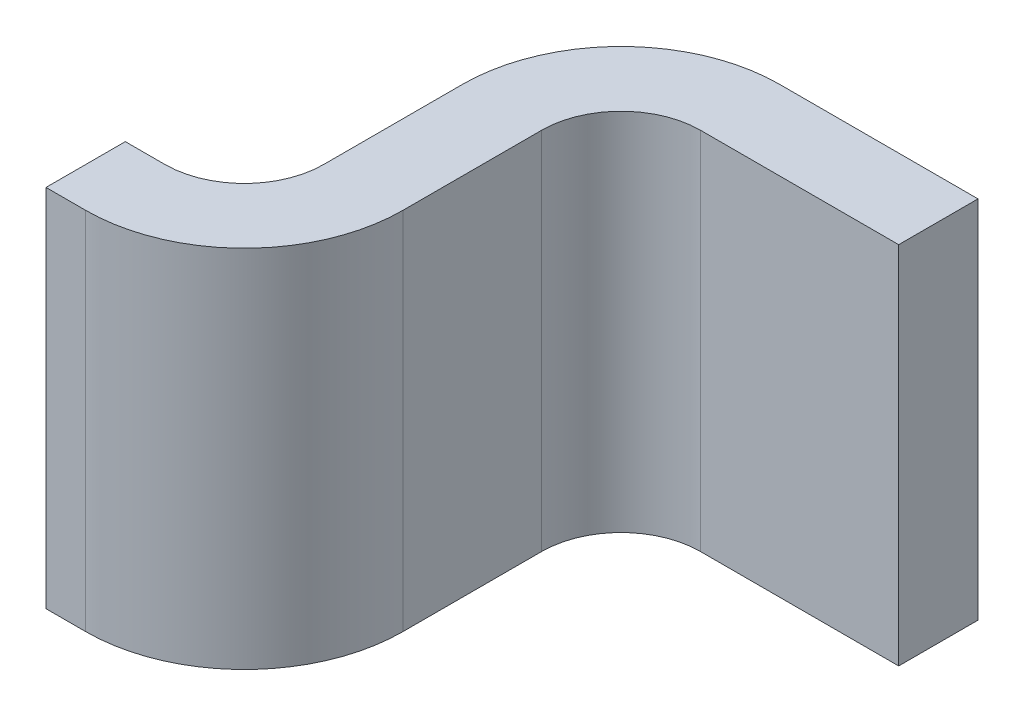
ISO-10303-21;
HEADER;
FILE_DESCRIPTION(('STEP AP214'),'2;1');
FILE_NAME('part.step','',(''),(''),'','','');
FILE_SCHEMA(('AUTOMOTIVE_DESIGN { 1 0 10303 214 1 1 1 1 }'));
ENDSEC;
DATA;
#1=APPLICATION_CONTEXT('core data for automotive mechanical design processes');
#2=APPLICATION_PROTOCOL_DEFINITION('international standard','automotive_design',2000,#1);
#3=PRODUCT_CONTEXT('',#1,'mechanical');
#4=PRODUCT('Part','Part','',(#3));
#5=PRODUCT_RELATED_PRODUCT_CATEGORY('part','',(#4));
#6=PRODUCT_DEFINITION_FORMATION('','',#4);
#7=PRODUCT_DEFINITION_CONTEXT('part definition',#1,'design');
#8=PRODUCT_DEFINITION('design','',#6,#7);
#9=PRODUCT_DEFINITION_SHAPE('','',#8);
#10=(LENGTH_UNIT() NAMED_UNIT(*) SI_UNIT(.MILLI.,.METRE.));
#11=(NAMED_UNIT(*) PLANE_ANGLE_UNIT() SI_UNIT($,.RADIAN.));
#12=(NAMED_UNIT(*) SI_UNIT($,.STERADIAN.) SOLID_ANGLE_UNIT());
#13=UNCERTAINTY_MEASURE_WITH_UNIT(LENGTH_MEASURE(1.E-05),#10,'distance_accuracy_value','');
#14=(GEOMETRIC_REPRESENTATION_CONTEXT(3) GLOBAL_UNCERTAINTY_ASSIGNED_CONTEXT((#13)) GLOBAL_UNIT_ASSIGNED_CONTEXT((#10,
#11,#12)) REPRESENTATION_CONTEXT('',''));
#15=CARTESIAN_POINT('',(0.,0.,0.));
#16=DIRECTION('',(0.,0.,1.));
#17=DIRECTION('',(1.,0.,0.));
#18=AXIS2_PLACEMENT_3D('',#15,#16,#17);
#19=CARTESIAN_POINT('',(0.,0.23,0.575));
#20=DIRECTION('',(0.,0.,-1.));
#21=DIRECTION('',(-1.,0.,0.));
#22=AXIS2_PLACEMENT_3D('',#19,#20,#21);
#23=PLANE('',#22);
#24=DIRECTION('',(1.,0.,0.));
#25=VECTOR('',#24,1.);
#26=CARTESIAN_POINT('',(0.,0.23,0.575));
#27=LINE('',#26,#25);
#28=CARTESIAN_POINT('',(0.05,0.23,0.575));
#29=VERTEX_POINT('',#28);
#30=CARTESIAN_POINT('',(0.,0.23,0.575));
#31=VERTEX_POINT('',#30);
#32=EDGE_CURVE('E192',#29,#31,#27,.F.);
#33=ORIENTED_EDGE('',*,*,#32,.T.);
#34=DIRECTION('',(0.,1.,0.));
#35=VECTOR('',#34,1.);
#36=CARTESIAN_POINT('',(0.,-0.23,0.575));
#37=LINE('',#36,#35);
#38=CARTESIAN_POINT('',(0.,-0.23,0.575));
#39=VERTEX_POINT('',#38);
#40=EDGE_CURVE('E94',#39,#31,#37,.T.);
#41=ORIENTED_EDGE('',*,*,#40,.F.);
#42=DIRECTION('',(1.,0.,0.));
#43=VECTOR('',#42,1.);
#44=CARTESIAN_POINT('',(0.,-0.23,0.575));
#45=LINE('',#44,#43);
#46=CARTESIAN_POINT('',(0.05,-0.23,0.575));
#47=VERTEX_POINT('',#46);
#48=EDGE_CURVE('E175',#39,#47,#45,.T.);
#49=ORIENTED_EDGE('',*,*,#48,.T.);
#50=DIRECTION('',(0.,1.,0.));
#51=VECTOR('',#50,1.);
#52=CARTESIAN_POINT('',(0.05,0.23,0.575));
#53=LINE('',#52,#51);
#54=EDGE_CURVE('E86',#29,#47,#53,.F.);
#55=ORIENTED_EDGE('',*,*,#54,.F.);
#56=EDGE_LOOP('',(#33,#41,#49,#55));
#57=FACE_BOUND('',#56,.T.);
#58=ADVANCED_FACE('F17',(#57),#23,.F.);
#59=CARTESIAN_POINT('',(0.,-0.23,0.475));
#60=DIRECTION('',(-1.,0.,0.));
#61=DIRECTION('',(0.,0.,1.));
#62=AXIS2_PLACEMENT_3D('',#59,#60,#61);
#63=PLANE('',#62);
#64=DIRECTION('',(0.,0.,1.));
#65=VECTOR('',#64,1.);
#66=CARTESIAN_POINT('',(0.,0.23,0.475));
#67=LINE('',#66,#65);
#68=CARTESIAN_POINT('',(0.,0.23,0.475));
#69=VERTEX_POINT('',#68);
#70=EDGE_CURVE('E182',#31,#69,#67,.F.);
#71=ORIENTED_EDGE('',*,*,#70,.T.);
#72=DIRECTION('',(0.,1.,0.));
#73=VECTOR('',#72,1.);
#74=CARTESIAN_POINT('',(0.,-0.23,0.475));
#75=LINE('',#74,#73);
#76=CARTESIAN_POINT('',(0.,-0.23,0.475));
#77=VERTEX_POINT('',#76);
#78=EDGE_CURVE('E165',#69,#77,#75,.F.);
#79=ORIENTED_EDGE('',*,*,#78,.T.);
#80=DIRECTION('',(0.,0.,1.));
#81=VECTOR('',#80,1.);
#82=CARTESIAN_POINT('',(0.,-0.23,0.575));
#83=LINE('',#82,#81);
#84=EDGE_CURVE('E177',#77,#39,#83,.T.);
#85=ORIENTED_EDGE('',*,*,#84,.T.);
#86=ORIENTED_EDGE('',*,*,#40,.T.);
#87=EDGE_LOOP('',(#71,#79,#85,#86));
#88=FACE_BOUND('',#87,.T.);
#89=ADVANCED_FACE('F227',(#88),#63,.T.);
#90=CARTESIAN_POINT('',(0.05,0.23,0.375));
#91=DIRECTION('',(0.,1.,0.));
#92=DIRECTION('',(0.,0.,1.));
#93=AXIS2_PLACEMENT_3D('',#90,#91,#92);
#94=CYLINDRICAL_SURFACE('',#93,0.2);
#95=CARTESIAN_POINT('',(0.05,0.23,0.375));
#96=DIRECTION('',(0.,1.,0.));
#97=DIRECTION('',(0.,0.,1.));
#98=AXIS2_PLACEMENT_3D('',#95,#96,#97);
#99=CIRCLE('',#98,0.2);
#100=CARTESIAN_POINT('',(0.25,0.23,0.375));
#101=VERTEX_POINT('',#100);
#102=EDGE_CURVE('E20',#29,#101,#99,.T.);
#103=ORIENTED_EDGE('',*,*,#102,.F.);
#104=ORIENTED_EDGE('',*,*,#54,.T.);
#105=CARTESIAN_POINT('',(0.05,-0.23,0.375));
#106=DIRECTION('',(0.,1.,0.));
#107=DIRECTION('',(0.,0.,1.));
#108=AXIS2_PLACEMENT_3D('',#105,#106,#107);
#109=CIRCLE('',#108,0.2);
#110=CARTESIAN_POINT('',(0.25,-0.23,0.375));
#111=VERTEX_POINT('',#110);
#112=EDGE_CURVE('E158',#111,#47,#109,.F.);
#113=ORIENTED_EDGE('',*,*,#112,.F.);
#114=DIRECTION('',(0.,1.,0.));
#115=VECTOR('',#114,1.);
#116=CARTESIAN_POINT('',(0.25,0.23,0.375));
#117=LINE('',#116,#115);
#118=EDGE_CURVE('E153',#111,#101,#117,.T.);
#119=ORIENTED_EDGE('',*,*,#118,.T.);
#120=EDGE_LOOP('',(#103,#104,#113,#119));
#121=FACE_BOUND('',#120,.T.);
#122=ADVANCED_FACE('F215',(#121),#94,.T.);
#123=CARTESIAN_POINT('',(0.35,0.23,0.1));
#124=DIRECTION('',(0.,0.,-1.));
#125=DIRECTION('',(-1.,0.,0.));
#126=AXIS2_PLACEMENT_3D('',#123,#124,#125);
#127=PLANE('',#126);
#128=DIRECTION('',(1.,0.,0.));
#129=VECTOR('',#128,1.);
#130=CARTESIAN_POINT('',(0.35,0.23,0.1));
#131=LINE('',#130,#129);
#132=CARTESIAN_POINT('',(0.6,0.23,0.1));
#133=VERTEX_POINT('',#132);
#134=CARTESIAN_POINT('',(0.35,0.23,0.1));
#135=VERTEX_POINT('',#134);
#136=EDGE_CURVE('E151',#133,#135,#131,.F.);
#137=ORIENTED_EDGE('',*,*,#136,.T.);
#138=DIRECTION('',(0.,-1.,0.));
#139=VECTOR('',#138,1.);
#140=CARTESIAN_POINT('',(0.35,0.23,0.1));
#141=LINE('',#140,#139);
#142=CARTESIAN_POINT('',(0.35,-0.23,0.1));
#143=VERTEX_POINT('',#142);
#144=EDGE_CURVE('E150',#135,#143,#141,.T.);
#145=ORIENTED_EDGE('',*,*,#144,.T.);
#146=DIRECTION('',(1.,0.,0.));
#147=VECTOR('',#146,1.);
#148=CARTESIAN_POINT('',(0.35,-0.23,0.1));
#149=LINE('',#148,#147);
#150=CARTESIAN_POINT('',(0.6,-0.23,0.1));
#151=VERTEX_POINT('',#150);
#152=EDGE_CURVE('E121',#143,#151,#149,.T.);
#153=ORIENTED_EDGE('',*,*,#152,.T.);
#154=DIRECTION('',(0.,1.,0.));
#155=VECTOR('',#154,1.);
#156=CARTESIAN_POINT('',(0.6,-0.23,0.1));
#157=LINE('',#156,#155);
#158=EDGE_CURVE('E118',#151,#133,#157,.T.);
#159=ORIENTED_EDGE('',*,*,#158,.T.);
#160=EDGE_LOOP('',(#137,#145,#153,#159));
#161=FACE_BOUND('',#160,.T.);
#162=ADVANCED_FACE('F265',(#161),#127,.F.);
#163=CARTESIAN_POINT('',(0.,-0.23,0.475));
#164=DIRECTION('',(0.,0.,1.));
#165=DIRECTION('',(1.,0.,0.));
#166=AXIS2_PLACEMENT_3D('',#163,#164,#165);
#167=PLANE('',#166);
#168=DIRECTION('',(1.,0.,0.));
#169=VECTOR('',#168,1.);
#170=CARTESIAN_POINT('',(0.,-0.23,0.475));
#171=LINE('',#170,#169);
#172=CARTESIAN_POINT('',(0.05,-0.23,0.475));
#173=VERTEX_POINT('',#172);
#174=EDGE_CURVE('E163',#77,#173,#171,.T.);
#175=ORIENTED_EDGE('',*,*,#174,.F.);
#176=ORIENTED_EDGE('',*,*,#78,.F.);
#177=DIRECTION('',(1.,0.,0.));
#178=VECTOR('',#177,1.);
#179=CARTESIAN_POINT('',(0.,0.23,0.475));
#180=LINE('',#179,#178);
#181=CARTESIAN_POINT('',(0.05,0.23,0.475));
#182=VERTEX_POINT('',#181);
#183=EDGE_CURVE('E168',#182,#69,#180,.F.);
#184=ORIENTED_EDGE('',*,*,#183,.F.);
#185=DIRECTION('',(0.,1.,0.));
#186=VECTOR('',#185,1.);
#187=CARTESIAN_POINT('',(0.05,-0.23,0.475));
#188=LINE('',#187,#186);
#189=EDGE_CURVE('E159',#182,#173,#188,.F.);
#190=ORIENTED_EDGE('',*,*,#189,.T.);
#191=EDGE_LOOP('',(#175,#176,#184,#190));
#192=FACE_BOUND('',#191,.T.);
#193=ADVANCED_FACE('F262',(#192),#167,.F.);
#194=CARTESIAN_POINT('',(0.25,0.23,0.375));
#195=DIRECTION('',(-1.,0.,0.));
#196=DIRECTION('',(0.,0.,1.));
#197=AXIS2_PLACEMENT_3D('',#194,#195,#196);
#198=PLANE('',#197);
#199=DIRECTION('',(0.,0.,-1.));
#200=VECTOR('',#199,1.);
#201=CARTESIAN_POINT('',(0.25,0.23,0.375));
#202=LINE('',#201,#200);
#203=CARTESIAN_POINT('',(0.25,0.23,0.2));
#204=VERTEX_POINT('',#203);
#205=EDGE_CURVE('E146',#204,#101,#202,.F.);
#206=ORIENTED_EDGE('',*,*,#205,.T.);
#207=ORIENTED_EDGE('',*,*,#118,.F.);
#208=DIRECTION('',(0.,0.,1.));
#209=VECTOR('',#208,1.);
#210=CARTESIAN_POINT('',(0.25,-0.23,0.375));
#211=LINE('',#210,#209);
#212=CARTESIAN_POINT('',(0.25,-0.23,0.2));
#213=VERTEX_POINT('',#212);
#214=EDGE_CURVE('E207',#111,#213,#211,.F.);
#215=ORIENTED_EDGE('',*,*,#214,.T.);
#216=DIRECTION('',(0.,-1.,0.));
#217=VECTOR('',#216,1.);
#218=CARTESIAN_POINT('',(0.25,0.23,0.2));
#219=LINE('',#218,#217);
#220=EDGE_CURVE('E120',#213,#204,#219,.F.);
#221=ORIENTED_EDGE('',*,*,#220,.T.);
#222=EDGE_LOOP('',(#206,#207,#215,#221));
#223=FACE_BOUND('',#222,.T.);
#224=ADVANCED_FACE('F217',(#223),#198,.F.);
#225=CARTESIAN_POINT('',(0.6,-0.23,0.));
#226=DIRECTION('',(-1.,0.,0.));
#227=DIRECTION('',(0.,0.,1.));
#228=AXIS2_PLACEMENT_3D('',#225,#226,#227);
#229=PLANE('',#228);
#230=DIRECTION('',(0.,0.,1.));
#231=VECTOR('',#230,1.);
#232=CARTESIAN_POINT('',(0.6,0.23,0.));
#233=LINE('',#232,#231);
#234=CARTESIAN_POINT('',(0.6,0.23,0.));
#235=VERTEX_POINT('',#234);
#236=EDGE_CURVE('E142',#133,#235,#233,.F.);
#237=ORIENTED_EDGE('',*,*,#236,.F.);
#238=ORIENTED_EDGE('',*,*,#158,.F.);
#239=DIRECTION('',(0.,0.,1.));
#240=VECTOR('',#239,1.);
#241=CARTESIAN_POINT('',(0.6,-0.23,0.1));
#242=LINE('',#241,#240);
#243=CARTESIAN_POINT('',(0.6,-0.23,0.));
#244=VERTEX_POINT('',#243);
#245=EDGE_CURVE('E111',#151,#244,#242,.F.);
#246=ORIENTED_EDGE('',*,*,#245,.T.);
#247=DIRECTION('',(0.,1.,0.));
#248=VECTOR('',#247,1.);
#249=CARTESIAN_POINT('',(0.6,-0.23,0.));
#250=LINE('',#249,#248);
#251=EDGE_CURVE('E116',#244,#235,#250,.T.);
#252=ORIENTED_EDGE('',*,*,#251,.T.);
#253=EDGE_LOOP('',(#237,#238,#246,#252));
#254=FACE_BOUND('',#253,.T.);
#255=ADVANCED_FACE('F114',(#254),#229,.F.);
#256=CARTESIAN_POINT('',(0.35,0.23,0.2));
#257=DIRECTION('',(0.,-1.,0.));
#258=DIRECTION('',(0.,0.,-1.));
#259=AXIS2_PLACEMENT_3D('',#256,#257,#258);
#260=CYLINDRICAL_SURFACE('',#259,0.1);
#261=CARTESIAN_POINT('',(0.35,0.23,0.2));
#262=DIRECTION('',(0.,-1.,0.));
#263=DIRECTION('',(0.,0.,-1.));
#264=AXIS2_PLACEMENT_3D('',#261,#262,#263);
#265=CIRCLE('',#264,0.1);
#266=EDGE_CURVE('E204',#204,#135,#265,.T.);
#267=ORIENTED_EDGE('',*,*,#266,.F.);
#268=ORIENTED_EDGE('',*,*,#220,.F.);
#269=CARTESIAN_POINT('',(0.35,-0.23,0.2));
#270=DIRECTION('',(0.,-1.,0.));
#271=DIRECTION('',(0.,0.,-1.));
#272=AXIS2_PLACEMENT_3D('',#269,#270,#271);
#273=CIRCLE('',#272,0.1);
#274=EDGE_CURVE('E133',#143,#213,#273,.F.);
#275=ORIENTED_EDGE('',*,*,#274,.F.);
#276=ORIENTED_EDGE('',*,*,#144,.F.);
#277=EDGE_LOOP('',(#267,#268,#275,#276));
#278=FACE_BOUND('',#277,.T.);
#279=ADVANCED_FACE('F253',(#278),#260,.F.);
#280=CARTESIAN_POINT('',(0.05,-0.23,0.375));
#281=DIRECTION('',(0.,1.,0.));
#282=DIRECTION('',(0.,0.,1.));
#283=AXIS2_PLACEMENT_3D('',#280,#281,#282);
#284=CYLINDRICAL_SURFACE('',#283,0.1);
#285=CARTESIAN_POINT('',(0.05,-0.23,0.375));
#286=DIRECTION('',(0.,1.,0.));
#287=DIRECTION('',(0.,0.,1.));
#288=AXIS2_PLACEMENT_3D('',#285,#286,#287);
#289=CIRCLE('',#288,0.1);
#290=CARTESIAN_POINT('',(0.15,-0.23,0.375));
#291=VERTEX_POINT('',#290);
#292=EDGE_CURVE('E162',#173,#291,#289,.T.);
#293=ORIENTED_EDGE('',*,*,#292,.F.);
#294=ORIENTED_EDGE('',*,*,#189,.F.);
#295=CARTESIAN_POINT('',(0.05,0.23,0.375));
#296=DIRECTION('',(0.,1.,0.));
#297=DIRECTION('',(0.,0.,1.));
#298=AXIS2_PLACEMENT_3D('',#295,#296,#297);
#299=CIRCLE('',#298,0.1);
#300=CARTESIAN_POINT('',(0.15,0.23,0.375));
#301=VERTEX_POINT('',#300);
#302=EDGE_CURVE('E149',#301,#182,#299,.F.);
#303=ORIENTED_EDGE('',*,*,#302,.F.);
#304=DIRECTION('',(0.,1.,0.));
#305=VECTOR('',#304,1.);
#306=CARTESIAN_POINT('',(0.15,-0.23,0.375));
#307=LINE('',#306,#305);
#308=EDGE_CURVE('E368',#301,#291,#307,.F.);
#309=ORIENTED_EDGE('',*,*,#308,.T.);
#310=EDGE_LOOP('',(#293,#294,#303,#309));
#311=FACE_BOUND('',#310,.T.);
#312=ADVANCED_FACE('F250',(#311),#284,.F.);
#313=CARTESIAN_POINT('',(0.243933982822,0.23,0.09393398282202));
#314=DIRECTION('',(0.,1.,0.));
#315=DIRECTION('',(0.,0.,1.));
#316=AXIS2_PLACEMENT_3D('',#313,#314,#315);
#317=PLANE('',#316);
#318=CARTESIAN_POINT('',(0.35,0.23,0.2));
#319=DIRECTION('',(0.,-1.,0.));
#320=DIRECTION('',(0.,0.,-1.));
#321=AXIS2_PLACEMENT_3D('',#318,#319,#320);
#322=CIRCLE('',#321,0.2);
#323=CARTESIAN_POINT('',(0.15,0.23,0.2));
#324=VERTEX_POINT('',#323);
#325=CARTESIAN_POINT('',(0.35,0.23,0.));
#326=VERTEX_POINT('',#325);
#327=EDGE_CURVE('E201',#324,#326,#322,.T.);
#328=ORIENTED_EDGE('',*,*,#327,.F.);
#329=DIRECTION('',(0.,0.,-1.));
#330=VECTOR('',#329,1.);
#331=CARTESIAN_POINT('',(0.15,0.23,0.375));
#332=LINE('',#331,#330);
#333=EDGE_CURVE('E135',#324,#301,#332,.F.);
#334=ORIENTED_EDGE('',*,*,#333,.T.);
#335=ORIENTED_EDGE('',*,*,#302,.T.);
#336=ORIENTED_EDGE('',*,*,#183,.T.);
#337=ORIENTED_EDGE('',*,*,#70,.F.);
#338=ORIENTED_EDGE('',*,*,#32,.F.);
#339=ORIENTED_EDGE('',*,*,#102,.T.);
#340=ORIENTED_EDGE('',*,*,#205,.F.);
#341=ORIENTED_EDGE('',*,*,#266,.T.);
#342=ORIENTED_EDGE('',*,*,#136,.F.);
#343=ORIENTED_EDGE('',*,*,#236,.T.);
#344=DIRECTION('',(1.,0.,0.));
#345=VECTOR('',#344,1.);
#346=CARTESIAN_POINT('',(0.35,0.23,0.));
#347=LINE('',#346,#345);
#348=EDGE_CURVE('E130',#235,#326,#347,.F.);
#349=ORIENTED_EDGE('',*,*,#348,.T.);
#350=EDGE_LOOP('',(#328,#334,#335,#336,#337,#338,#339,#340,#341,#342,#343,#349));
#351=FACE_BOUND('',#350,.T.);
#352=ADVANCED_FACE('F224',(#351),#317,.T.);
#353=CARTESIAN_POINT('',(0.35,-0.23,0.));
#354=DIRECTION('',(0.,0.,1.));
#355=DIRECTION('',(1.,0.,0.));
#356=AXIS2_PLACEMENT_3D('',#353,#354,#355);
#357=PLANE('',#356);
#358=DIRECTION('',(1.,0.,0.));
#359=VECTOR('',#358,1.);
#360=CARTESIAN_POINT('',(0.35,-0.23,0.));
#361=LINE('',#360,#359);
#362=CARTESIAN_POINT('',(0.35,-0.23,0.));
#363=VERTEX_POINT('',#362);
#364=EDGE_CURVE('E123',#363,#244,#361,.T.);
#365=ORIENTED_EDGE('',*,*,#364,.F.);
#366=DIRECTION('',(0.,-1.,0.));
#367=VECTOR('',#366,1.);
#368=CARTESIAN_POINT('',(0.35,-0.23,0.));
#369=LINE('',#368,#367);
#370=EDGE_CURVE('E200',#326,#363,#369,.T.);
#371=ORIENTED_EDGE('',*,*,#370,.F.);
#372=ORIENTED_EDGE('',*,*,#348,.F.);
#373=ORIENTED_EDGE('',*,*,#251,.F.);
#374=EDGE_LOOP('',(#365,#371,#372,#373));
#375=FACE_BOUND('',#374,.T.);
#376=ADVANCED_FACE('F132',(#375),#357,.F.);
#377=CARTESIAN_POINT('',(0.243933982822,-0.23,0.09393398282202));
#378=DIRECTION('',(0.,-1.,0.));
#379=DIRECTION('',(0.,0.,-1.));
#380=AXIS2_PLACEMENT_3D('',#377,#378,#379);
#381=PLANE('',#380);
#382=ORIENTED_EDGE('',*,*,#274,.T.);
#383=ORIENTED_EDGE('',*,*,#214,.F.);
#384=ORIENTED_EDGE('',*,*,#112,.T.);
#385=ORIENTED_EDGE('',*,*,#48,.F.);
#386=ORIENTED_EDGE('',*,*,#84,.F.);
#387=ORIENTED_EDGE('',*,*,#174,.T.);
#388=ORIENTED_EDGE('',*,*,#292,.T.);
#389=DIRECTION('',(0.,0.,-1.));
#390=VECTOR('',#389,1.);
#391=CARTESIAN_POINT('',(0.15,-0.23,0.375));
#392=LINE('',#391,#390);
#393=CARTESIAN_POINT('',(0.15,-0.23,0.2));
#394=VERTEX_POINT('',#393);
#395=EDGE_CURVE('E35',#291,#394,#392,.T.);
#396=ORIENTED_EDGE('',*,*,#395,.T.);
#397=CARTESIAN_POINT('',(0.35,-0.23,0.2));
#398=DIRECTION('',(0.,-1.,0.));
#399=DIRECTION('',(0.,0.,-1.));
#400=AXIS2_PLACEMENT_3D('',#397,#398,#399);
#401=CIRCLE('',#400,0.2);
#402=EDGE_CURVE('E26',#363,#394,#401,.F.);
#403=ORIENTED_EDGE('',*,*,#402,.F.);
#404=ORIENTED_EDGE('',*,*,#364,.T.);
#405=ORIENTED_EDGE('',*,*,#245,.F.);
#406=ORIENTED_EDGE('',*,*,#152,.F.);
#407=EDGE_LOOP('',(#382,#383,#384,#385,#386,#387,#388,#396,#403,#404,#405,#406));
#408=FACE_BOUND('',#407,.T.);
#409=ADVANCED_FACE('F125',(#408),#381,.T.);
#410=CARTESIAN_POINT('',(0.15,-0.23,0.375));
#411=DIRECTION('',(1.,0.,0.));
#412=DIRECTION('',(0.,0.,-1.));
#413=AXIS2_PLACEMENT_3D('',#410,#411,#412);
#414=PLANE('',#413);
#415=ORIENTED_EDGE('',*,*,#395,.F.);
#416=ORIENTED_EDGE('',*,*,#308,.F.);
#417=ORIENTED_EDGE('',*,*,#333,.F.);
#418=DIRECTION('',(0.,-1.,0.));
#419=VECTOR('',#418,1.);
#420=CARTESIAN_POINT('',(0.15,-0.23,0.2));
#421=LINE('',#420,#419);
#422=EDGE_CURVE('E11',#394,#324,#421,.F.);
#423=ORIENTED_EDGE('',*,*,#422,.F.);
#424=EDGE_LOOP('',(#415,#416,#417,#423));
#425=FACE_BOUND('',#424,.T.);
#426=ADVANCED_FACE('F235',(#425),#414,.F.);
#427=CARTESIAN_POINT('',(0.35,-0.23,0.2));
#428=DIRECTION('',(0.,-1.,0.));
#429=DIRECTION('',(0.,0.,-1.));
#430=AXIS2_PLACEMENT_3D('',#427,#428,#429);
#431=CYLINDRICAL_SURFACE('',#430,0.2);
#432=ORIENTED_EDGE('',*,*,#402,.T.);
#433=ORIENTED_EDGE('',*,*,#422,.T.);
#434=ORIENTED_EDGE('',*,*,#327,.T.);
#435=ORIENTED_EDGE('',*,*,#370,.T.);
#436=EDGE_LOOP('',(#432,#433,#434,#435));
#437=FACE_BOUND('',#436,.T.);
#438=ADVANCED_FACE('F233',(#437),#431,.T.);
#439=CLOSED_SHELL('',(#58,#89,#122,#162,#193,#224,#255,#279,#312,#352,#376,#409,#426,#438));
#440=MANIFOLD_SOLID_BREP('B1',#439);
#441=ADVANCED_BREP_SHAPE_REPRESENTATION('',(#18,#440),#14);
#442=SHAPE_DEFINITION_REPRESENTATION(#9,#441);
ENDSEC;
END-ISO-10303-21;
